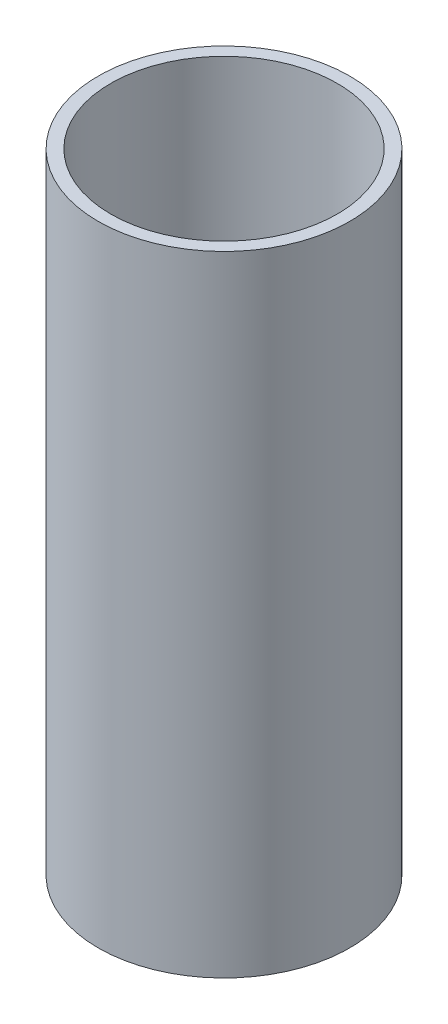
ISO-10303-21;
HEADER;
FILE_DESCRIPTION(('STEP AP214'),'2;1');
FILE_NAME('part.step','',(''),(''),'','','');
FILE_SCHEMA(('AUTOMOTIVE_DESIGN { 1 0 10303 214 1 1 1 1 }'));
ENDSEC;
DATA;
#1=APPLICATION_CONTEXT('core data for automotive mechanical design processes');
#2=APPLICATION_PROTOCOL_DEFINITION('international standard','automotive_design',2000,#1);
#3=PRODUCT_CONTEXT('',#1,'mechanical');
#4=PRODUCT('Part','Part','',(#3));
#5=PRODUCT_RELATED_PRODUCT_CATEGORY('part','',(#4));
#6=PRODUCT_DEFINITION_FORMATION('','',#4);
#7=PRODUCT_DEFINITION_CONTEXT('part definition',#1,'design');
#8=PRODUCT_DEFINITION('design','',#6,#7);
#9=PRODUCT_DEFINITION_SHAPE('','',#8);
#10=(LENGTH_UNIT() NAMED_UNIT(*) SI_UNIT(.MILLI.,.METRE.));
#11=(NAMED_UNIT(*) PLANE_ANGLE_UNIT() SI_UNIT($,.RADIAN.));
#12=(NAMED_UNIT(*) SI_UNIT($,.STERADIAN.) SOLID_ANGLE_UNIT());
#13=UNCERTAINTY_MEASURE_WITH_UNIT(LENGTH_MEASURE(1.E-05),#10,'distance_accuracy_value','');
#14=(GEOMETRIC_REPRESENTATION_CONTEXT(3) GLOBAL_UNCERTAINTY_ASSIGNED_CONTEXT((#13)) GLOBAL_UNIT_ASSIGNED_CONTEXT((#10,
#11,#12)) REPRESENTATION_CONTEXT('',''));
#15=CARTESIAN_POINT('',(0.,0.,0.));
#16=DIRECTION('',(0.,0.,1.));
#17=DIRECTION('',(1.,0.,0.));
#18=AXIS2_PLACEMENT_3D('',#15,#16,#17);
#19=CARTESIAN_POINT('',(0.,100.,0.));
#20=DIRECTION('',(0.,1.,0.));
#21=DIRECTION('',(0.,0.,1.));
#22=AXIS2_PLACEMENT_3D('',#19,#20,#21);
#23=PLANE('',#22);
#24=CARTESIAN_POINT('',(0.,100.,0.));
#25=DIRECTION('',(0.,1.,0.));
#26=DIRECTION('',(0.,0.,1.));
#27=AXIS2_PLACEMENT_3D('',#24,#25,#26);
#28=CIRCLE('',#27,20.);
#29=CARTESIAN_POINT('',(0.,100.,20.));
#30=VERTEX_POINT('',#29);
#31=EDGE_CURVE('E10',#30,#30,#28,.T.);
#32=ORIENTED_EDGE('',*,*,#31,.T.);
#33=EDGE_LOOP('',(#32));
#34=FACE_BOUND('',#33,.T.);
#35=CARTESIAN_POINT('',(0.,100.,0.));
#36=DIRECTION('',(0.,1.,0.));
#37=DIRECTION('',(0.,0.,1.));
#38=AXIS2_PLACEMENT_3D('',#35,#36,#37);
#39=CIRCLE('',#38,18.);
#40=CARTESIAN_POINT('',(0.,100.,18.));
#41=VERTEX_POINT('',#40);
#42=EDGE_CURVE('E48',#41,#41,#39,.T.);
#43=ORIENTED_EDGE('',*,*,#42,.F.);
#44=EDGE_LOOP('',(#43));
#45=FACE_BOUND('',#44,.T.);
#46=ADVANCED_FACE('F37',(#34,#45),#23,.T.);
#47=CARTESIAN_POINT('',(0.,0.,0.));
#48=DIRECTION('',(0.,1.,0.));
#49=DIRECTION('',(0.,0.,1.));
#50=AXIS2_PLACEMENT_3D('',#47,#48,#49);
#51=PLANE('',#50);
#52=CARTESIAN_POINT('',(0.,0.,0.));
#53=DIRECTION('',(0.,1.,0.));
#54=DIRECTION('',(0.,0.,1.));
#55=AXIS2_PLACEMENT_3D('',#52,#53,#54);
#56=CIRCLE('',#55,20.);
#57=CARTESIAN_POINT('',(0.,0.,20.));
#58=VERTEX_POINT('',#57);
#59=EDGE_CURVE('E41',#58,#58,#56,.T.);
#60=ORIENTED_EDGE('',*,*,#59,.F.);
#61=EDGE_LOOP('',(#60));
#62=FACE_BOUND('',#61,.T.);
#63=CARTESIAN_POINT('',(0.,0.,0.));
#64=DIRECTION('',(0.,1.,0.));
#65=DIRECTION('',(0.,0.,1.));
#66=AXIS2_PLACEMENT_3D('',#63,#64,#65);
#67=CIRCLE('',#66,18.);
#68=CARTESIAN_POINT('',(0.,0.,18.));
#69=VERTEX_POINT('',#68);
#70=EDGE_CURVE('E50',#69,#69,#67,.T.);
#71=ORIENTED_EDGE('',*,*,#70,.T.);
#72=EDGE_LOOP('',(#71));
#73=FACE_BOUND('',#72,.T.);
#74=ADVANCED_FACE('F60',(#62,#73),#51,.F.);
#75=CARTESIAN_POINT('',(0.,100.,0.));
#76=DIRECTION('',(0.,-1.,0.));
#77=DIRECTION('',(0.,0.,-1.));
#78=AXIS2_PLACEMENT_3D('',#75,#76,#77);
#79=CYLINDRICAL_SURFACE('',#78,20.);
#80=ORIENTED_EDGE('',*,*,#31,.F.);
#81=EDGE_LOOP('',(#80));
#82=FACE_BOUND('',#81,.T.);
#83=ORIENTED_EDGE('',*,*,#59,.T.);
#84=EDGE_LOOP('',(#83));
#85=FACE_BOUND('',#84,.T.);
#86=ADVANCED_FACE('F39',(#82,#85),#79,.T.);
#87=CARTESIAN_POINT('',(0.,100.,0.));
#88=DIRECTION('',(0.,-1.,0.));
#89=DIRECTION('',(0.,0.,-1.));
#90=AXIS2_PLACEMENT_3D('',#87,#88,#89);
#91=CYLINDRICAL_SURFACE('',#90,18.);
#92=ORIENTED_EDGE('',*,*,#42,.T.);
#93=EDGE_LOOP('',(#92));
#94=FACE_BOUND('',#93,.T.);
#95=ORIENTED_EDGE('',*,*,#70,.F.);
#96=EDGE_LOOP('',(#95));
#97=FACE_BOUND('',#96,.T.);
#98=ADVANCED_FACE('F56',(#94,#97),#91,.F.);
#99=CLOSED_SHELL('',(#46,#74,#86,#98));
#100=MANIFOLD_SOLID_BREP('B2',#99);
#101=ADVANCED_BREP_SHAPE_REPRESENTATION('',(#18,#100),#14);
#102=SHAPE_DEFINITION_REPRESENTATION(#9,#101);
ENDSEC;
END-ISO-10303-21;
